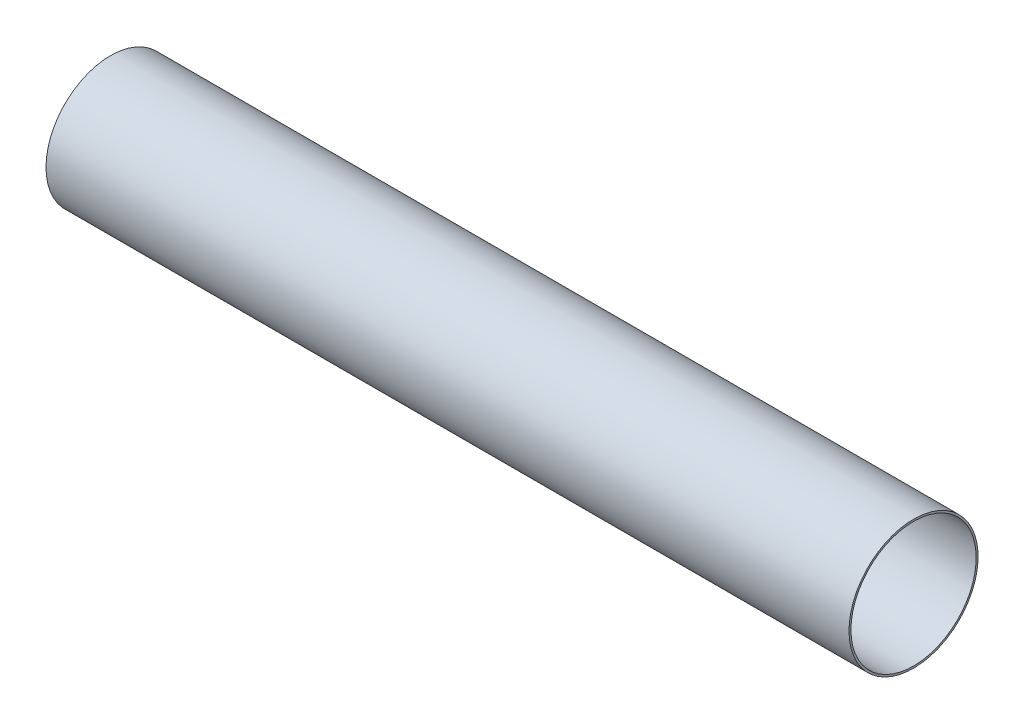
ISO-10303-21;
HEADER;
FILE_DESCRIPTION(('STEP AP214'),'2;1');
FILE_NAME('part.step','',(''),(''),'','','');
FILE_SCHEMA(('AUTOMOTIVE_DESIGN { 1 0 10303 214 1 1 1 1 }'));
ENDSEC;
DATA;
#1=APPLICATION_CONTEXT('core data for automotive mechanical design processes');
#2=APPLICATION_PROTOCOL_DEFINITION('international standard','automotive_design',2000,#1);
#3=PRODUCT_CONTEXT('',#1,'mechanical');
#4=PRODUCT('Part','Part','',(#3));
#5=PRODUCT_RELATED_PRODUCT_CATEGORY('part','',(#4));
#6=PRODUCT_DEFINITION_FORMATION('','',#4);
#7=PRODUCT_DEFINITION_CONTEXT('part definition',#1,'design');
#8=PRODUCT_DEFINITION('design','',#6,#7);
#9=PRODUCT_DEFINITION_SHAPE('','',#8);
#10=(LENGTH_UNIT() NAMED_UNIT(*) SI_UNIT(.MILLI.,.METRE.));
#11=(NAMED_UNIT(*) PLANE_ANGLE_UNIT() SI_UNIT($,.RADIAN.));
#12=(NAMED_UNIT(*) SI_UNIT($,.STERADIAN.) SOLID_ANGLE_UNIT());
#13=UNCERTAINTY_MEASURE_WITH_UNIT(LENGTH_MEASURE(1.E-05),#10,'distance_accuracy_value','');
#14=(GEOMETRIC_REPRESENTATION_CONTEXT(3) GLOBAL_UNCERTAINTY_ASSIGNED_CONTEXT((#13)) GLOBAL_UNIT_ASSIGNED_CONTEXT((#10,
#11,#12)) REPRESENTATION_CONTEXT('',''));
#15=CARTESIAN_POINT('',(0.,0.,0.));
#16=DIRECTION('',(0.,0.,1.));
#17=DIRECTION('',(1.,0.,0.));
#18=AXIS2_PLACEMENT_3D('',#15,#16,#17);
#19=CARTESIAN_POINT('',(635.,0.,0.));
#20=DIRECTION('',(1.,0.,0.));
#21=DIRECTION('',(0.,0.,-1.));
#22=AXIS2_PLACEMENT_3D('',#19,#20,#21);
#23=PLANE('',#22);
#24=CARTESIAN_POINT('',(635.,0.,0.));
#25=DIRECTION('',(1.,0.,0.));
#26=DIRECTION('',(0.,0.,-1.));
#27=AXIS2_PLACEMENT_3D('',#24,#25,#26);
#28=CIRCLE('',#27,51.054);
#29=CARTESIAN_POINT('',(635.,0.,51.054));
#30=VERTEX_POINT('',#29);
#31=EDGE_CURVE('E10',#30,#30,#28,.T.);
#32=ORIENTED_EDGE('',*,*,#31,.T.);
#33=EDGE_LOOP('',(#32));
#34=FACE_BOUND('',#33,.T.);
#35=CARTESIAN_POINT('',(635.,0.,0.));
#36=DIRECTION('',(1.,0.,0.));
#37=DIRECTION('',(0.,0.,-1.));
#38=AXIS2_PLACEMENT_3D('',#35,#36,#37);
#39=CIRCLE('',#38,49.53);
#40=CARTESIAN_POINT('',(635.,0.,49.53));
#41=VERTEX_POINT('',#40);
#42=EDGE_CURVE('E48',#41,#41,#39,.T.);
#43=ORIENTED_EDGE('',*,*,#42,.F.);
#44=EDGE_LOOP('',(#43));
#45=FACE_BOUND('',#44,.T.);
#46=ADVANCED_FACE('F37',(#34,#45),#23,.T.);
#47=CARTESIAN_POINT('',(0.,0.,0.));
#48=DIRECTION('',(1.,0.,0.));
#49=DIRECTION('',(0.,0.,-1.));
#50=AXIS2_PLACEMENT_3D('',#47,#48,#49);
#51=PLANE('',#50);
#52=CARTESIAN_POINT('',(0.,0.,0.));
#53=DIRECTION('',(1.,0.,0.));
#54=DIRECTION('',(0.,0.,-1.));
#55=AXIS2_PLACEMENT_3D('',#52,#53,#54);
#56=CIRCLE('',#55,51.054);
#57=CARTESIAN_POINT('',(-1.11022302462516E-13,0.,51.054));
#58=VERTEX_POINT('',#57);
#59=EDGE_CURVE('E41',#58,#58,#56,.T.);
#60=ORIENTED_EDGE('',*,*,#59,.F.);
#61=EDGE_LOOP('',(#60));
#62=FACE_BOUND('',#61,.T.);
#63=CARTESIAN_POINT('',(0.,0.,0.));
#64=DIRECTION('',(1.,0.,0.));
#65=DIRECTION('',(0.,0.,-1.));
#66=AXIS2_PLACEMENT_3D('',#63,#64,#65);
#67=CIRCLE('',#66,49.53);
#68=CARTESIAN_POINT('',(-1.11022302462516E-13,0.,49.53));
#69=VERTEX_POINT('',#68);
#70=EDGE_CURVE('E50',#69,#69,#67,.T.);
#71=ORIENTED_EDGE('',*,*,#70,.T.);
#72=EDGE_LOOP('',(#71));
#73=FACE_BOUND('',#72,.T.);
#74=ADVANCED_FACE('F60',(#62,#73),#51,.F.);
#75=CARTESIAN_POINT('',(635.,0.,0.));
#76=DIRECTION('',(-1.,0.,0.));
#77=DIRECTION('',(0.,0.,1.));
#78=AXIS2_PLACEMENT_3D('',#75,#76,#77);
#79=CYLINDRICAL_SURFACE('',#78,51.054);
#80=CARTESIAN_POINT('',(635.,0.,51.054));
#81=CARTESIAN_POINT('',(628.385416666667,0.,51.054));
#82=CARTESIAN_POINT('',(621.770833333333,0.,51.054));
#83=CARTESIAN_POINT('',(608.541666666667,0.,51.054));
#84=CARTESIAN_POINT('',(601.927083333333,0.,51.054));
#85=CARTESIAN_POINT('',(588.697916666667,0.,51.054));
#86=CARTESIAN_POINT('',(582.083333333333,0.,51.054));
#87=CARTESIAN_POINT('',(568.854166666667,0.,51.054));
#88=CARTESIAN_POINT('',(562.239583333333,0.,51.054));
#89=CARTESIAN_POINT('',(549.010416666667,0.,51.054));
#90=CARTESIAN_POINT('',(542.395833333333,0.,51.054));
#91=CARTESIAN_POINT('',(529.166666666667,0.,51.054));
#92=CARTESIAN_POINT('',(522.552083333333,0.,51.054));
#93=CARTESIAN_POINT('',(509.322916666667,0.,51.054));
#94=CARTESIAN_POINT('',(502.708333333333,0.,51.054));
#95=CARTESIAN_POINT('',(489.479166666667,0.,51.054));
#96=CARTESIAN_POINT('',(482.864583333333,0.,51.054));
#97=CARTESIAN_POINT('',(469.635416666667,0.,51.054));
#98=CARTESIAN_POINT('',(463.020833333333,0.,51.054));
#99=CARTESIAN_POINT('',(449.791666666667,0.,51.054));
#100=CARTESIAN_POINT('',(443.177083333333,0.,51.054));
#101=CARTESIAN_POINT('',(429.947916666667,0.,51.054));
#102=CARTESIAN_POINT('',(423.333333333333,0.,51.054));
#103=CARTESIAN_POINT('',(410.104166666667,0.,51.054));
#104=CARTESIAN_POINT('',(403.489583333333,0.,51.054));
#105=CARTESIAN_POINT('',(390.260416666667,0.,51.054));
#106=CARTESIAN_POINT('',(383.645833333333,0.,51.054));
#107=CARTESIAN_POINT('',(370.416666666667,0.,51.054));
#108=CARTESIAN_POINT('',(363.802083333333,0.,51.054));
#109=CARTESIAN_POINT('',(350.572916666667,0.,51.054));
#110=CARTESIAN_POINT('',(343.958333333333,0.,51.054));
#111=CARTESIAN_POINT('',(330.729166666667,0.,51.054));
#112=CARTESIAN_POINT('',(324.114583333333,0.,51.054));
#113=CARTESIAN_POINT('',(310.885416666667,0.,51.054));
#114=CARTESIAN_POINT('',(304.270833333333,0.,51.054));
#115=CARTESIAN_POINT('',(291.041666666667,0.,51.054));
#116=CARTESIAN_POINT('',(284.427083333333,0.,51.054));
#117=CARTESIAN_POINT('',(271.197916666667,0.,51.054));
#118=CARTESIAN_POINT('',(264.583333333333,0.,51.054));
#119=CARTESIAN_POINT('',(251.354166666667,0.,51.054));
#120=CARTESIAN_POINT('',(244.739583333333,0.,51.054));
#121=CARTESIAN_POINT('',(231.510416666667,0.,51.054));
#122=CARTESIAN_POINT('',(224.895833333333,0.,51.054));
#123=CARTESIAN_POINT('',(211.666666666667,0.,51.054));
#124=CARTESIAN_POINT('',(205.052083333333,0.,51.054));
#125=CARTESIAN_POINT('',(191.822916666667,0.,51.054));
#126=CARTESIAN_POINT('',(185.208333333333,0.,51.054));
#127=CARTESIAN_POINT('',(171.979166666667,0.,51.054));
#128=CARTESIAN_POINT('',(165.364583333333,0.,51.054));
#129=CARTESIAN_POINT('',(152.135416666667,0.,51.054));
#130=CARTESIAN_POINT('',(145.520833333333,0.,51.054));
#131=CARTESIAN_POINT('',(132.291666666667,0.,51.054));
#132=CARTESIAN_POINT('',(125.677083333333,0.,51.054));
#133=CARTESIAN_POINT('',(112.447916666667,0.,51.054));
#134=CARTESIAN_POINT('',(105.833333333333,0.,51.054));
#135=CARTESIAN_POINT('',(92.6041666666666,0.,51.054));
#136=CARTESIAN_POINT('',(85.9895833333332,0.,51.054));
#137=CARTESIAN_POINT('',(72.7604166666665,0.,51.054));
#138=CARTESIAN_POINT('',(66.1458333333332,0.,51.054));
#139=CARTESIAN_POINT('',(52.9166666666666,0.,51.054));
#140=CARTESIAN_POINT('',(46.3020833333332,0.,51.054));
#141=CARTESIAN_POINT('',(33.0729166666666,0.,51.054));
#142=CARTESIAN_POINT('',(26.4583333333333,0.,51.054));
#143=CARTESIAN_POINT('',(13.2291666666666,0.,51.054));
#144=CARTESIAN_POINT('',(6.61458333333324,0.,51.054));
#145=CARTESIAN_POINT('',(-1.11022302462516E-13,0.,51.054));
#146=B_SPLINE_CURVE_WITH_KNOTS('',3,(#80,#81,#82,#83,#84,#85,#86,#87,#88,#89,#90,#91,#92,#93,
#94,#95,#96,#97,#98,#99,#100,#101,#102,#103,#104,#105,#106,#107,#108,#109,#110,#111,#112,#113,
#114,#115,#116,#117,#118,#119,#120,#121,#122,#123,#124,#125,#126,#127,#128,#129,#130,#131,#132,
#133,#134,#135,#136,#137,#138,#139,#140,#141,#142,#143,#144,#145),.UNSPECIFIED.,.F.,.F.,(4,2,2,
2,2,2,2,2,2,2,2,2,2,2,2,2,2,2,2,2,2,2,2,2,2,2,2,2,2,2,2,2,4),(0.,19.8437499999999,39.6875,
59.5312499999999,79.375,99.2187499999999,119.0625,138.90625,158.75,178.59375,198.4375,218.28125,
238.125,257.96875,277.8125,297.65625,317.5,337.34375,357.1875,377.03125,396.875,416.71875,
436.5625,456.40625,476.25,496.09375,515.9375,535.78125,555.625,575.46875,595.3125,615.15625,
635.),.UNSPECIFIED.);
#147=EDGE_CURVE('BSEAM39',#30,#58,#146,.T.);
#148=ORIENTED_EDGE('',*,*,#31,.F.);
#149=ORIENTED_EDGE('',*,*,#59,.T.);
#150=ORIENTED_EDGE('',*,*,#147,.T.);
#151=ORIENTED_EDGE('',*,*,#147,.F.);
#152=EDGE_LOOP('',(#148,#150,#149,#151));
#153=FACE_BOUND('',#152,.T.);
#154=ADVANCED_FACE('F39',(#153),#79,.T.);
#155=CARTESIAN_POINT('',(635.,0.,0.));
#156=DIRECTION('',(-1.,0.,0.));
#157=DIRECTION('',(0.,0.,1.));
#158=AXIS2_PLACEMENT_3D('',#155,#156,#157);
#159=CYLINDRICAL_SURFACE('',#158,49.53);
#160=CARTESIAN_POINT('',(635.,0.,49.53));
#161=CARTESIAN_POINT('',(628.385416666667,0.,49.53));
#162=CARTESIAN_POINT('',(621.770833333333,0.,49.53));
#163=CARTESIAN_POINT('',(608.541666666667,0.,49.53));
#164=CARTESIAN_POINT('',(601.927083333333,0.,49.53));
#165=CARTESIAN_POINT('',(588.697916666667,0.,49.53));
#166=CARTESIAN_POINT('',(582.083333333333,0.,49.53));
#167=CARTESIAN_POINT('',(568.854166666667,0.,49.53));
#168=CARTESIAN_POINT('',(562.239583333333,0.,49.53));
#169=CARTESIAN_POINT('',(549.010416666667,0.,49.53));
#170=CARTESIAN_POINT('',(542.395833333333,0.,49.53));
#171=CARTESIAN_POINT('',(529.166666666667,0.,49.53));
#172=CARTESIAN_POINT('',(522.552083333333,0.,49.53));
#173=CARTESIAN_POINT('',(509.322916666667,0.,49.53));
#174=CARTESIAN_POINT('',(502.708333333333,0.,49.53));
#175=CARTESIAN_POINT('',(489.479166666667,0.,49.53));
#176=CARTESIAN_POINT('',(482.864583333333,0.,49.53));
#177=CARTESIAN_POINT('',(469.635416666667,0.,49.53));
#178=CARTESIAN_POINT('',(463.020833333333,0.,49.53));
#179=CARTESIAN_POINT('',(449.791666666667,0.,49.53));
#180=CARTESIAN_POINT('',(443.177083333333,0.,49.53));
#181=CARTESIAN_POINT('',(429.947916666667,0.,49.53));
#182=CARTESIAN_POINT('',(423.333333333333,0.,49.53));
#183=CARTESIAN_POINT('',(410.104166666667,0.,49.53));
#184=CARTESIAN_POINT('',(403.489583333333,0.,49.53));
#185=CARTESIAN_POINT('',(390.260416666667,0.,49.53));
#186=CARTESIAN_POINT('',(383.645833333333,0.,49.53));
#187=CARTESIAN_POINT('',(370.416666666667,0.,49.53));
#188=CARTESIAN_POINT('',(363.802083333333,0.,49.53));
#189=CARTESIAN_POINT('',(350.572916666667,0.,49.53));
#190=CARTESIAN_POINT('',(343.958333333333,0.,49.53));
#191=CARTESIAN_POINT('',(330.729166666667,0.,49.53));
#192=CARTESIAN_POINT('',(324.114583333333,0.,49.53));
#193=CARTESIAN_POINT('',(310.885416666667,0.,49.53));
#194=CARTESIAN_POINT('',(304.270833333333,0.,49.53));
#195=CARTESIAN_POINT('',(291.041666666667,0.,49.53));
#196=CARTESIAN_POINT('',(284.427083333333,0.,49.53));
#197=CARTESIAN_POINT('',(271.197916666667,0.,49.53));
#198=CARTESIAN_POINT('',(264.583333333333,0.,49.53));
#199=CARTESIAN_POINT('',(251.354166666667,0.,49.53));
#200=CARTESIAN_POINT('',(244.739583333333,0.,49.53));
#201=CARTESIAN_POINT('',(231.510416666667,0.,49.53));
#202=CARTESIAN_POINT('',(224.895833333333,0.,49.53));
#203=CARTESIAN_POINT('',(211.666666666667,0.,49.53));
#204=CARTESIAN_POINT('',(205.052083333333,0.,49.53));
#205=CARTESIAN_POINT('',(191.822916666666,0.,49.53));
#206=CARTESIAN_POINT('',(185.208333333333,0.,49.53));
#207=CARTESIAN_POINT('',(171.979166666666,0.,49.53));
#208=CARTESIAN_POINT('',(165.364583333333,0.,49.53));
#209=CARTESIAN_POINT('',(152.135416666666,0.,49.53));
#210=CARTESIAN_POINT('',(145.520833333333,0.,49.53));
#211=CARTESIAN_POINT('',(132.291666666667,0.,49.53));
#212=CARTESIAN_POINT('',(125.677083333333,0.,49.53));
#213=CARTESIAN_POINT('',(112.447916666667,0.,49.53));
#214=CARTESIAN_POINT('',(105.833333333333,0.,49.53));
#215=CARTESIAN_POINT('',(92.6041666666666,0.,49.53));
#216=CARTESIAN_POINT('',(85.9895833333332,0.,49.53));
#217=CARTESIAN_POINT('',(72.7604166666665,0.,49.53));
#218=CARTESIAN_POINT('',(66.1458333333332,0.,49.53));
#219=CARTESIAN_POINT('',(52.9166666666666,0.,49.53));
#220=CARTESIAN_POINT('',(46.3020833333332,0.,49.53));
#221=CARTESIAN_POINT('',(33.0729166666666,0.,49.53));
#222=CARTESIAN_POINT('',(26.4583333333333,0.,49.53));
#223=CARTESIAN_POINT('',(13.2291666666666,0.,49.53));
#224=CARTESIAN_POINT('',(6.61458333333324,0.,49.53));
#225=CARTESIAN_POINT('',(-1.11022302462516E-13,0.,49.53));
#226=B_SPLINE_CURVE_WITH_KNOTS('',3,(#160,#161,#162,#163,#164,#165,#166,#167,#168,#169,#170,
#171,#172,#173,#174,#175,#176,#177,#178,#179,#180,#181,#182,#183,#184,#185,#186,#187,#188,#189,
#190,#191,#192,#193,#194,#195,#196,#197,#198,#199,#200,#201,#202,#203,#204,#205,#206,#207,#208,
#209,#210,#211,#212,#213,#214,#215,#216,#217,#218,#219,#220,#221,#222,#223,#224,#225),
.UNSPECIFIED.,.F.,.F.,(4,2,2,2,2,2,2,2,2,2,2,2,2,2,2,2,2,2,2,2,2,2,2,2,2,2,2,2,2,2,2,2,4),(0.,
19.84375,39.6875000000001,59.53125,79.3750000000001,99.2187500000001,119.0625,138.90625,158.75,
178.59375,198.4375,218.28125,238.125,257.96875,277.8125,297.65625,317.5,337.34375,357.1875,
377.03125,396.875,416.71875,436.5625,456.40625,476.25,496.09375,515.9375,535.78125,555.625,
575.46875,595.3125,615.15625,635.),.UNSPECIFIED.);
#227=EDGE_CURVE('BSEAM56',#41,#69,#226,.T.);
#228=ORIENTED_EDGE('',*,*,#42,.T.);
#229=ORIENTED_EDGE('',*,*,#70,.F.);
#230=ORIENTED_EDGE('',*,*,#227,.T.);
#231=ORIENTED_EDGE('',*,*,#227,.F.);
#232=EDGE_LOOP('',(#228,#230,#229,#231));
#233=FACE_BOUND('',#232,.T.);
#234=ADVANCED_FACE('F56',(#233),#159,.F.);
#235=CLOSED_SHELL('',(#46,#74,#154,#234));
#236=MANIFOLD_SOLID_BREP('B2',#235);
#237=ADVANCED_BREP_SHAPE_REPRESENTATION('',(#18,#236),#14);
#238=SHAPE_DEFINITION_REPRESENTATION(#9,#237);
ENDSEC;
END-ISO-10303-21;
